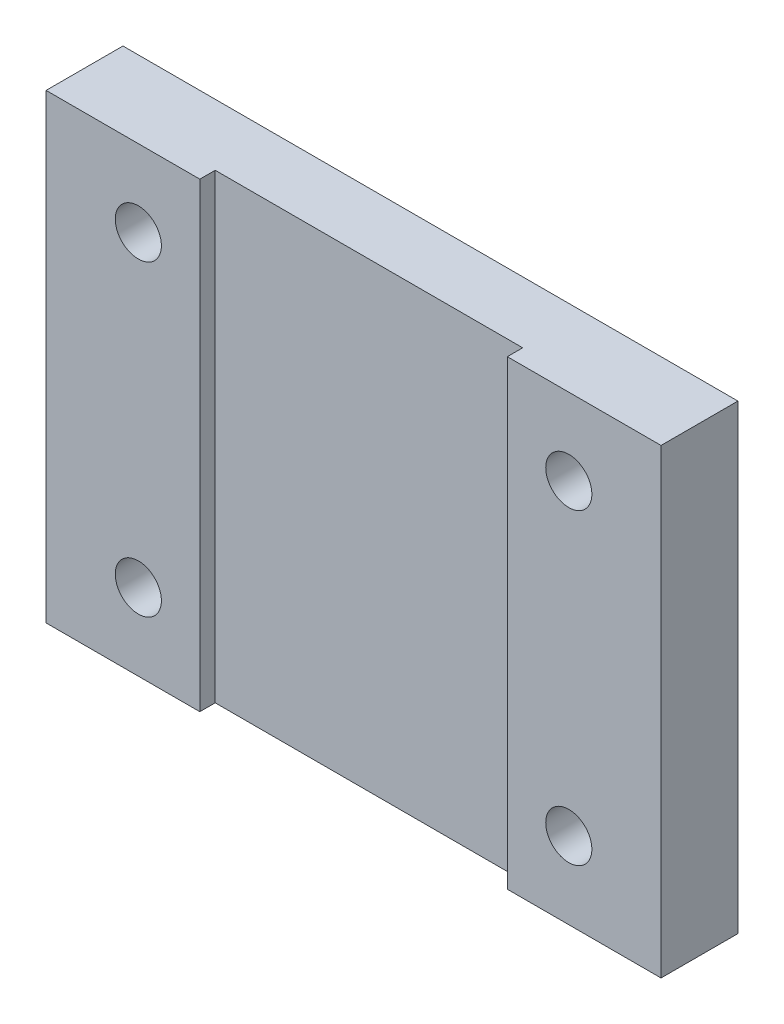
ISO-10303-21;
HEADER;
FILE_DESCRIPTION(('STEP AP214'),'2;1');
FILE_NAME('part.step','',(''),(''),'','','');
FILE_SCHEMA(('AUTOMOTIVE_DESIGN { 1 0 10303 214 1 1 1 1 }'));
ENDSEC;
DATA;
#1=APPLICATION_CONTEXT('core data for automotive mechanical design processes');
#2=APPLICATION_PROTOCOL_DEFINITION('international standard','automotive_design',2000,#1);
#3=PRODUCT_CONTEXT('',#1,'mechanical');
#4=PRODUCT('Part','Part','',(#3));
#5=PRODUCT_RELATED_PRODUCT_CATEGORY('part','',(#4));
#6=PRODUCT_DEFINITION_FORMATION('','',#4);
#7=PRODUCT_DEFINITION_CONTEXT('part definition',#1,'design');
#8=PRODUCT_DEFINITION('design','',#6,#7);
#9=PRODUCT_DEFINITION_SHAPE('','',#8);
#10=(LENGTH_UNIT() NAMED_UNIT(*) SI_UNIT(.MILLI.,.METRE.));
#11=(NAMED_UNIT(*) PLANE_ANGLE_UNIT() SI_UNIT($,.RADIAN.));
#12=(NAMED_UNIT(*) SI_UNIT($,.STERADIAN.) SOLID_ANGLE_UNIT());
#13=UNCERTAINTY_MEASURE_WITH_UNIT(LENGTH_MEASURE(1.E-05),#10,'distance_accuracy_value','');
#14=(GEOMETRIC_REPRESENTATION_CONTEXT(3) GLOBAL_UNCERTAINTY_ASSIGNED_CONTEXT((#13)) GLOBAL_UNIT_ASSIGNED_CONTEXT((#10,
#11,#12)) REPRESENTATION_CONTEXT('',''));
#15=CARTESIAN_POINT('',(0.,0.,0.));
#16=DIRECTION('',(0.,0.,1.));
#17=DIRECTION('',(1.,0.,0.));
#18=AXIS2_PLACEMENT_3D('',#15,#16,#17);
#19=CARTESIAN_POINT('',(0.,0.,5.));
#20=DIRECTION('',(0.,0.,1.));
#21=DIRECTION('',(1.,0.,0.));
#22=AXIS2_PLACEMENT_3D('',#19,#20,#21);
#23=PLANE('',#22);
#24=DIRECTION('',(0.,1.,0.));
#25=VECTOR('',#24,1.);
#26=CARTESIAN_POINT('',(10.,-15.,5.));
#27=LINE('',#26,#25);
#28=CARTESIAN_POINT('',(10.,-15.,5.));
#29=VERTEX_POINT('',#28);
#30=CARTESIAN_POINT('',(10.,15.,5.));
#31=VERTEX_POINT('',#30);
#32=EDGE_CURVE('E131',#29,#31,#27,.T.);
#33=ORIENTED_EDGE('',*,*,#32,.F.);
#34=DIRECTION('',(1.,0.,0.));
#35=VECTOR('',#34,1.);
#36=CARTESIAN_POINT('',(-20.,-15.,5.));
#37=LINE('',#36,#35);
#38=CARTESIAN_POINT('',(20.,-15.,5.));
#39=VERTEX_POINT('',#38);
#40=EDGE_CURVE('E64',#29,#39,#37,.T.);
#41=ORIENTED_EDGE('',*,*,#40,.T.);
#42=DIRECTION('',(0.,1.,0.));
#43=VECTOR('',#42,1.);
#44=CARTESIAN_POINT('',(20.,15.,5.));
#45=LINE('',#44,#43);
#46=CARTESIAN_POINT('',(20.,15.,5.));
#47=VERTEX_POINT('',#46);
#48=EDGE_CURVE('E180',#39,#47,#45,.T.);
#49=ORIENTED_EDGE('',*,*,#48,.T.);
#50=DIRECTION('',(-1.,0.,0.));
#51=VECTOR('',#50,1.);
#52=CARTESIAN_POINT('',(-20.,15.,5.));
#53=LINE('',#52,#51);
#54=EDGE_CURVE('E93',#47,#31,#53,.T.);
#55=ORIENTED_EDGE('',*,*,#54,.T.);
#56=EDGE_LOOP('',(#33,#41,#49,#55));
#57=FACE_BOUND('',#56,.T.);
#58=CARTESIAN_POINT('',(14.,-10.,5.));
#59=DIRECTION('',(0.,0.,1.));
#60=DIRECTION('',(1.,0.,0.));
#61=AXIS2_PLACEMENT_3D('',#58,#59,#60);
#62=CIRCLE('',#61,1.5);
#63=CARTESIAN_POINT('',(15.5,-10.,5.));
#64=VERTEX_POINT('',#63);
#65=EDGE_CURVE('E163',#64,#64,#62,.T.);
#66=ORIENTED_EDGE('',*,*,#65,.F.);
#67=EDGE_LOOP('',(#66));
#68=FACE_BOUND('',#67,.T.);
#69=CARTESIAN_POINT('',(14.,10.,5.));
#70=DIRECTION('',(0.,0.,1.));
#71=DIRECTION('',(1.,0.,0.));
#72=AXIS2_PLACEMENT_3D('',#69,#70,#71);
#73=CIRCLE('',#72,1.5);
#74=CARTESIAN_POINT('',(15.5,10.,5.));
#75=VERTEX_POINT('',#74);
#76=EDGE_CURVE('E167',#75,#75,#73,.T.);
#77=ORIENTED_EDGE('',*,*,#76,.F.);
#78=EDGE_LOOP('',(#77));
#79=FACE_BOUND('',#78,.T.);
#80=ADVANCED_FACE('F39',(#57,#68,#79),#23,.T.);
#81=CARTESIAN_POINT('',(20.,15.,5.));
#82=DIRECTION('',(-1.,0.,0.));
#83=DIRECTION('',(0.,-1.,0.));
#84=AXIS2_PLACEMENT_3D('',#81,#82,#83);
#85=PLANE('',#84);
#86=DIRECTION('',(0.,1.,0.));
#87=VECTOR('',#86,1.);
#88=CARTESIAN_POINT('',(20.,15.,0.));
#89=LINE('',#88,#87);
#90=CARTESIAN_POINT('',(20.,-15.,0.));
#91=VERTEX_POINT('',#90);
#92=CARTESIAN_POINT('',(20.,15.,0.));
#93=VERTEX_POINT('',#92);
#94=EDGE_CURVE('E179',#91,#93,#89,.T.);
#95=ORIENTED_EDGE('',*,*,#94,.T.);
#96=DIRECTION('',(0.,0.,-1.));
#97=VECTOR('',#96,1.);
#98=CARTESIAN_POINT('',(20.,15.,5.));
#99=LINE('',#98,#97);
#100=EDGE_CURVE('E11',#47,#93,#99,.T.);
#101=ORIENTED_EDGE('',*,*,#100,.F.);
#102=ORIENTED_EDGE('',*,*,#48,.F.);
#103=DIRECTION('',(0.,0.,-1.));
#104=VECTOR('',#103,1.);
#105=CARTESIAN_POINT('',(20.,-15.,5.));
#106=LINE('',#105,#104);
#107=EDGE_CURVE('E192',#39,#91,#106,.T.);
#108=ORIENTED_EDGE('',*,*,#107,.T.);
#109=EDGE_LOOP('',(#95,#101,#102,#108));
#110=FACE_BOUND('',#109,.T.);
#111=ADVANCED_FACE('F41',(#110),#85,.F.);
#112=CARTESIAN_POINT('',(-20.,15.,5.));
#113=DIRECTION('',(0.,-1.,0.));
#114=DIRECTION('',(0.,0.,-1.));
#115=AXIS2_PLACEMENT_3D('',#112,#113,#114);
#116=PLANE('',#115);
#117=DIRECTION('',(-1.,0.,0.));
#118=VECTOR('',#117,1.);
#119=CARTESIAN_POINT('',(10.,15.,4.));
#120=LINE('',#119,#118);
#121=CARTESIAN_POINT('',(10.,15.,4.));
#122=VERTEX_POINT('',#121);
#123=CARTESIAN_POINT('',(-10.,15.,4.));
#124=VERTEX_POINT('',#123);
#125=EDGE_CURVE('E123',#122,#124,#120,.T.);
#126=ORIENTED_EDGE('',*,*,#125,.F.);
#127=DIRECTION('',(0.,0.,1.));
#128=VECTOR('',#127,1.);
#129=CARTESIAN_POINT('',(10.,15.,4.));
#130=LINE('',#129,#128);
#131=EDGE_CURVE('E159',#122,#31,#130,.T.);
#132=ORIENTED_EDGE('',*,*,#131,.T.);
#133=ORIENTED_EDGE('',*,*,#54,.F.);
#134=ORIENTED_EDGE('',*,*,#100,.T.);
#135=DIRECTION('',(-1.,0.,0.));
#136=VECTOR('',#135,1.);
#137=CARTESIAN_POINT('',(-20.,15.,0.));
#138=LINE('',#137,#136);
#139=CARTESIAN_POINT('',(-20.,15.,0.));
#140=VERTEX_POINT('',#139);
#141=EDGE_CURVE('E196',#93,#140,#138,.T.);
#142=ORIENTED_EDGE('',*,*,#141,.T.);
#143=DIRECTION('',(0.,0.,-1.));
#144=VECTOR('',#143,1.);
#145=CARTESIAN_POINT('',(-20.,15.,5.));
#146=LINE('',#145,#144);
#147=CARTESIAN_POINT('',(-20.,15.,5.));
#148=VERTEX_POINT('',#147);
#149=EDGE_CURVE('E48',#148,#140,#146,.T.);
#150=ORIENTED_EDGE('',*,*,#149,.F.);
#151=CARTESIAN_POINT('',(-10.,15.,5.));
#152=VERTEX_POINT('',#151);
#153=EDGE_CURVE('E136',#152,#148,#53,.T.);
#154=ORIENTED_EDGE('',*,*,#153,.F.);
#155=DIRECTION('',(0.,0.,1.));
#156=VECTOR('',#155,1.);
#157=CARTESIAN_POINT('',(-10.,15.,4.));
#158=LINE('',#157,#156);
#159=EDGE_CURVE('E55',#124,#152,#158,.T.);
#160=ORIENTED_EDGE('',*,*,#159,.F.);
#161=EDGE_LOOP('',(#126,#132,#133,#134,#142,#150,#154,#160));
#162=FACE_BOUND('',#161,.T.);
#163=ADVANCED_FACE('F134',(#162),#116,.F.);
#164=CARTESIAN_POINT('',(-20.,15.,5.));
#165=DIRECTION('',(1.,0.,0.));
#166=DIRECTION('',(0.,1.,0.));
#167=AXIS2_PLACEMENT_3D('',#164,#165,#166);
#168=PLANE('',#167);
#169=DIRECTION('',(0.,-1.,0.));
#170=VECTOR('',#169,1.);
#171=CARTESIAN_POINT('',(-20.,15.,0.));
#172=LINE('',#171,#170);
#173=CARTESIAN_POINT('',(-20.,-15.,0.));
#174=VERTEX_POINT('',#173);
#175=EDGE_CURVE('E199',#140,#174,#172,.T.);
#176=ORIENTED_EDGE('',*,*,#175,.T.);
#177=DIRECTION('',(0.,0.,-1.));
#178=VECTOR('',#177,1.);
#179=CARTESIAN_POINT('',(-20.,-15.,5.));
#180=LINE('',#179,#178);
#181=CARTESIAN_POINT('',(-20.,-15.,5.));
#182=VERTEX_POINT('',#181);
#183=EDGE_CURVE('E206',#182,#174,#180,.T.);
#184=ORIENTED_EDGE('',*,*,#183,.F.);
#185=DIRECTION('',(0.,-1.,0.));
#186=VECTOR('',#185,1.);
#187=CARTESIAN_POINT('',(-20.,15.,5.));
#188=LINE('',#187,#186);
#189=EDGE_CURVE('E185',#148,#182,#188,.T.);
#190=ORIENTED_EDGE('',*,*,#189,.F.);
#191=ORIENTED_EDGE('',*,*,#149,.T.);
#192=EDGE_LOOP('',(#176,#184,#190,#191));
#193=FACE_BOUND('',#192,.T.);
#194=ADVANCED_FACE('F213',(#193),#168,.F.);
#195=CARTESIAN_POINT('',(-20.,-15.,5.));
#196=DIRECTION('',(0.,1.,0.));
#197=DIRECTION('',(0.,0.,1.));
#198=AXIS2_PLACEMENT_3D('',#195,#196,#197);
#199=PLANE('',#198);
#200=ORIENTED_EDGE('',*,*,#40,.F.);
#201=DIRECTION('',(0.,0.,1.));
#202=VECTOR('',#201,1.);
#203=CARTESIAN_POINT('',(10.,-15.,4.));
#204=LINE('',#203,#202);
#205=CARTESIAN_POINT('',(10.,-15.,4.));
#206=VERTEX_POINT('',#205);
#207=EDGE_CURVE('E141',#206,#29,#204,.T.);
#208=ORIENTED_EDGE('',*,*,#207,.F.);
#209=DIRECTION('',(1.,0.,0.));
#210=VECTOR('',#209,1.);
#211=CARTESIAN_POINT('',(-10.,-15.,4.));
#212=LINE('',#211,#210);
#213=CARTESIAN_POINT('',(-10.,-15.,4.));
#214=VERTEX_POINT('',#213);
#215=EDGE_CURVE('E122',#214,#206,#212,.T.);
#216=ORIENTED_EDGE('',*,*,#215,.F.);
#217=DIRECTION('',(0.,0.,1.));
#218=VECTOR('',#217,1.);
#219=CARTESIAN_POINT('',(-10.,-15.,4.));
#220=LINE('',#219,#218);
#221=CARTESIAN_POINT('',(-10.,-15.,5.));
#222=VERTEX_POINT('',#221);
#223=EDGE_CURVE('E118',#214,#222,#220,.T.);
#224=ORIENTED_EDGE('',*,*,#223,.T.);
#225=EDGE_CURVE('E188',#182,#222,#37,.T.);
#226=ORIENTED_EDGE('',*,*,#225,.F.);
#227=ORIENTED_EDGE('',*,*,#183,.T.);
#228=DIRECTION('',(1.,0.,0.));
#229=VECTOR('',#228,1.);
#230=CARTESIAN_POINT('',(-20.,-15.,0.));
#231=LINE('',#230,#229);
#232=EDGE_CURVE('E86',#174,#91,#231,.T.);
#233=ORIENTED_EDGE('',*,*,#232,.T.);
#234=ORIENTED_EDGE('',*,*,#107,.F.);
#235=EDGE_LOOP('',(#200,#208,#216,#224,#226,#227,#233,#234));
#236=FACE_BOUND('',#235,.T.);
#237=ADVANCED_FACE('F221',(#236),#199,.F.);
#238=DIRECTION('',(0.,-1.,0.));
#239=VECTOR('',#238,1.);
#240=CARTESIAN_POINT('',(-10.,15.,5.));
#241=LINE('',#240,#239);
#242=EDGE_CURVE('E232',#152,#222,#241,.T.);
#243=ORIENTED_EDGE('',*,*,#242,.F.);
#244=ORIENTED_EDGE('',*,*,#153,.T.);
#245=ORIENTED_EDGE('',*,*,#189,.T.);
#246=ORIENTED_EDGE('',*,*,#225,.T.);
#247=EDGE_LOOP('',(#243,#244,#245,#246));
#248=FACE_BOUND('',#247,.T.);
#249=CARTESIAN_POINT('',(-14.,-10.,5.));
#250=DIRECTION('',(0.,0.,1.));
#251=DIRECTION('',(1.,0.,0.));
#252=AXIS2_PLACEMENT_3D('',#249,#250,#251);
#253=CIRCLE('',#252,1.5);
#254=CARTESIAN_POINT('',(-12.5,-10.,5.));
#255=VERTEX_POINT('',#254);
#256=EDGE_CURVE('E150',#255,#255,#253,.T.);
#257=ORIENTED_EDGE('',*,*,#256,.F.);
#258=EDGE_LOOP('',(#257));
#259=FACE_BOUND('',#258,.T.);
#260=CARTESIAN_POINT('',(-14.,10.,5.));
#261=DIRECTION('',(0.,0.,1.));
#262=DIRECTION('',(1.,0.,0.));
#263=AXIS2_PLACEMENT_3D('',#260,#261,#262);
#264=CIRCLE('',#263,1.5);
#265=CARTESIAN_POINT('',(-12.5,10.,5.));
#266=VERTEX_POINT('',#265);
#267=EDGE_CURVE('E175',#266,#266,#264,.T.);
#268=ORIENTED_EDGE('',*,*,#267,.F.);
#269=EDGE_LOOP('',(#268));
#270=FACE_BOUND('',#269,.T.);
#271=ADVANCED_FACE('F240',(#248,#259,#270),#23,.T.);
#272=CARTESIAN_POINT('',(0.,0.,0.));
#273=DIRECTION('',(0.,0.,1.));
#274=DIRECTION('',(1.,0.,0.));
#275=AXIS2_PLACEMENT_3D('',#272,#273,#274);
#276=PLANE('',#275);
#277=CARTESIAN_POINT('',(14.,10.,0.));
#278=DIRECTION('',(0.,0.,-1.));
#279=DIRECTION('',(-1.,0.,0.));
#280=AXIS2_PLACEMENT_3D('',#277,#278,#279);
#281=CIRCLE('',#280,1.5);
#282=CARTESIAN_POINT('',(12.5,10.,0.));
#283=VERTEX_POINT('',#282);
#284=EDGE_CURVE('E146',#283,#283,#281,.T.);
#285=ORIENTED_EDGE('',*,*,#284,.F.);
#286=EDGE_LOOP('',(#285));
#287=FACE_BOUND('',#286,.T.);
#288=CARTESIAN_POINT('',(14.,-10.,0.));
#289=DIRECTION('',(0.,0.,-1.));
#290=DIRECTION('',(-1.,0.,0.));
#291=AXIS2_PLACEMENT_3D('',#288,#289,#290);
#292=CIRCLE('',#291,1.5);
#293=CARTESIAN_POINT('',(12.5,-10.,0.));
#294=VERTEX_POINT('',#293);
#295=EDGE_CURVE('E151',#294,#294,#292,.T.);
#296=ORIENTED_EDGE('',*,*,#295,.F.);
#297=EDGE_LOOP('',(#296));
#298=FACE_BOUND('',#297,.T.);
#299=CARTESIAN_POINT('',(-14.,-10.,0.));
#300=DIRECTION('',(0.,0.,-1.));
#301=DIRECTION('',(-1.,0.,0.));
#302=AXIS2_PLACEMENT_3D('',#299,#300,#301);
#303=CIRCLE('',#302,1.5);
#304=CARTESIAN_POINT('',(-15.5,-10.,0.));
#305=VERTEX_POINT('',#304);
#306=EDGE_CURVE('E155',#305,#305,#303,.T.);
#307=ORIENTED_EDGE('',*,*,#306,.F.);
#308=EDGE_LOOP('',(#307));
#309=FACE_BOUND('',#308,.T.);
#310=CARTESIAN_POINT('',(-14.,10.,0.));
#311=DIRECTION('',(0.,0.,-1.));
#312=DIRECTION('',(-1.,0.,0.));
#313=AXIS2_PLACEMENT_3D('',#310,#311,#312);
#314=CIRCLE('',#313,1.5);
#315=CARTESIAN_POINT('',(-15.5,10.,0.));
#316=VERTEX_POINT('',#315);
#317=EDGE_CURVE('E171',#316,#316,#314,.T.);
#318=ORIENTED_EDGE('',*,*,#317,.F.);
#319=EDGE_LOOP('',(#318));
#320=FACE_BOUND('',#319,.T.);
#321=ORIENTED_EDGE('',*,*,#94,.F.);
#322=ORIENTED_EDGE('',*,*,#232,.F.);
#323=ORIENTED_EDGE('',*,*,#175,.F.);
#324=ORIENTED_EDGE('',*,*,#141,.F.);
#325=EDGE_LOOP('',(#321,#322,#323,#324));
#326=FACE_BOUND('',#325,.T.);
#327=ADVANCED_FACE('F217',(#287,#298,#309,#320,#326),#276,.F.);
#328=CARTESIAN_POINT('',(-14.,10.,10.));
#329=DIRECTION('',(0.,0.,-1.));
#330=DIRECTION('',(-1.,0.,0.));
#331=AXIS2_PLACEMENT_3D('',#328,#329,#330);
#332=CYLINDRICAL_SURFACE('',#331,1.5);
#333=ORIENTED_EDGE('',*,*,#267,.T.);
#334=EDGE_LOOP('',(#333));
#335=FACE_BOUND('',#334,.T.);
#336=ORIENTED_EDGE('',*,*,#317,.T.);
#337=EDGE_LOOP('',(#336));
#338=FACE_BOUND('',#337,.T.);
#339=ADVANCED_FACE('F254',(#335,#338),#332,.F.);
#340=CARTESIAN_POINT('',(-14.,-10.,10.));
#341=DIRECTION('',(0.,0.,-1.));
#342=DIRECTION('',(-1.,0.,0.));
#343=AXIS2_PLACEMENT_3D('',#340,#341,#342);
#344=CYLINDRICAL_SURFACE('',#343,1.5);
#345=ORIENTED_EDGE('',*,*,#256,.T.);
#346=EDGE_LOOP('',(#345));
#347=FACE_BOUND('',#346,.T.);
#348=ORIENTED_EDGE('',*,*,#306,.T.);
#349=EDGE_LOOP('',(#348));
#350=FACE_BOUND('',#349,.T.);
#351=ADVANCED_FACE('F263',(#347,#350),#344,.F.);
#352=CARTESIAN_POINT('',(14.,-10.,10.));
#353=DIRECTION('',(0.,0.,-1.));
#354=DIRECTION('',(-1.,0.,0.));
#355=AXIS2_PLACEMENT_3D('',#352,#353,#354);
#356=CYLINDRICAL_SURFACE('',#355,1.5);
#357=ORIENTED_EDGE('',*,*,#65,.T.);
#358=EDGE_LOOP('',(#357));
#359=FACE_BOUND('',#358,.T.);
#360=ORIENTED_EDGE('',*,*,#295,.T.);
#361=EDGE_LOOP('',(#360));
#362=FACE_BOUND('',#361,.T.);
#363=ADVANCED_FACE('F248',(#359,#362),#356,.F.);
#364=CARTESIAN_POINT('',(14.,10.,10.));
#365=DIRECTION('',(0.,0.,-1.));
#366=DIRECTION('',(-1.,0.,0.));
#367=AXIS2_PLACEMENT_3D('',#364,#365,#366);
#368=CYLINDRICAL_SURFACE('',#367,1.5);
#369=ORIENTED_EDGE('',*,*,#76,.T.);
#370=EDGE_LOOP('',(#369));
#371=FACE_BOUND('',#370,.T.);
#372=ORIENTED_EDGE('',*,*,#284,.T.);
#373=EDGE_LOOP('',(#372));
#374=FACE_BOUND('',#373,.T.);
#375=ADVANCED_FACE('F245',(#371,#374),#368,.F.);
#376=CARTESIAN_POINT('',(10.,-15.,4.));
#377=DIRECTION('',(1.,0.,0.));
#378=DIRECTION('',(0.,1.,0.));
#379=AXIS2_PLACEMENT_3D('',#376,#377,#378);
#380=PLANE('',#379);
#381=ORIENTED_EDGE('',*,*,#32,.T.);
#382=ORIENTED_EDGE('',*,*,#131,.F.);
#383=DIRECTION('',(0.,1.,0.));
#384=VECTOR('',#383,1.);
#385=CARTESIAN_POINT('',(10.,-15.,4.));
#386=LINE('',#385,#384);
#387=EDGE_CURVE('E129',#206,#122,#386,.T.);
#388=ORIENTED_EDGE('',*,*,#387,.F.);
#389=ORIENTED_EDGE('',*,*,#207,.T.);
#390=EDGE_LOOP('',(#381,#382,#388,#389));
#391=FACE_BOUND('',#390,.T.);
#392=ADVANCED_FACE('F236',(#391),#380,.F.);
#393=CARTESIAN_POINT('',(-10.,15.,4.));
#394=DIRECTION('',(-1.,0.,0.));
#395=DIRECTION('',(0.,-1.,0.));
#396=AXIS2_PLACEMENT_3D('',#393,#394,#395);
#397=PLANE('',#396);
#398=ORIENTED_EDGE('',*,*,#242,.T.);
#399=ORIENTED_EDGE('',*,*,#223,.F.);
#400=DIRECTION('',(0.,-1.,0.));
#401=VECTOR('',#400,1.);
#402=CARTESIAN_POINT('',(-10.,15.,4.));
#403=LINE('',#402,#401);
#404=EDGE_CURVE('E114',#124,#214,#403,.T.);
#405=ORIENTED_EDGE('',*,*,#404,.F.);
#406=ORIENTED_EDGE('',*,*,#159,.T.);
#407=EDGE_LOOP('',(#398,#399,#405,#406));
#408=FACE_BOUND('',#407,.T.);
#409=ADVANCED_FACE('F116',(#408),#397,.F.);
#410=CARTESIAN_POINT('',(0.,0.,4.));
#411=DIRECTION('',(0.,0.,1.));
#412=DIRECTION('',(1.,0.,0.));
#413=AXIS2_PLACEMENT_3D('',#410,#411,#412);
#414=PLANE('',#413);
#415=ORIENTED_EDGE('',*,*,#125,.T.);
#416=ORIENTED_EDGE('',*,*,#404,.T.);
#417=ORIENTED_EDGE('',*,*,#215,.T.);
#418=ORIENTED_EDGE('',*,*,#387,.T.);
#419=EDGE_LOOP('',(#415,#416,#417,#418));
#420=FACE_BOUND('',#419,.T.);
#421=ADVANCED_FACE('F127',(#420),#414,.T.);
#422=CLOSED_SHELL('',(#80,#111,#163,#194,#237,#271,#327,#339,#351,#363,#375,#392,#409,#421));
#423=MANIFOLD_SOLID_BREP('B2',#422);
#424=ADVANCED_BREP_SHAPE_REPRESENTATION('',(#18,#423),#14);
#425=SHAPE_DEFINITION_REPRESENTATION(#9,#424);
ENDSEC;
END-ISO-10303-21;
